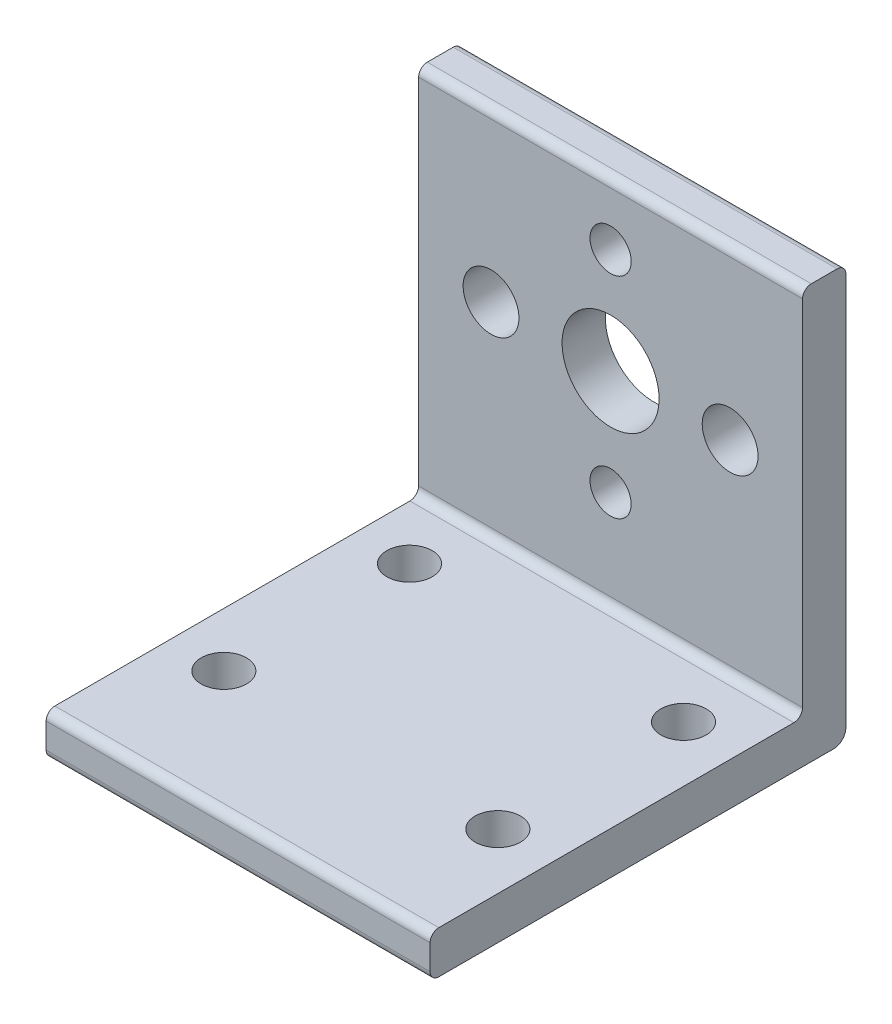
ISO-10303-21;
HEADER;
FILE_DESCRIPTION(('STEP AP214'),'2;1');
FILE_NAME('part.step','',(''),(''),'','','');
FILE_SCHEMA(('AUTOMOTIVE_DESIGN { 1 0 10303 214 1 1 1 1 }'));
ENDSEC;
DATA;
#1=APPLICATION_CONTEXT('core data for automotive mechanical design processes');
#2=APPLICATION_PROTOCOL_DEFINITION('international standard','automotive_design',2000,#1);
#3=PRODUCT_CONTEXT('',#1,'mechanical');
#4=PRODUCT('Part','Part','',(#3));
#5=PRODUCT_RELATED_PRODUCT_CATEGORY('part','',(#4));
#6=PRODUCT_DEFINITION_FORMATION('','',#4);
#7=PRODUCT_DEFINITION_CONTEXT('part definition',#1,'design');
#8=PRODUCT_DEFINITION('design','',#6,#7);
#9=PRODUCT_DEFINITION_SHAPE('','',#8);
#10=(LENGTH_UNIT() NAMED_UNIT(*) SI_UNIT(.MILLI.,.METRE.));
#11=(NAMED_UNIT(*) PLANE_ANGLE_UNIT() SI_UNIT($,.RADIAN.));
#12=(NAMED_UNIT(*) SI_UNIT($,.STERADIAN.) SOLID_ANGLE_UNIT());
#13=UNCERTAINTY_MEASURE_WITH_UNIT(LENGTH_MEASURE(1.E-05),#10,'distance_accuracy_value','');
#14=(GEOMETRIC_REPRESENTATION_CONTEXT(3) GLOBAL_UNCERTAINTY_ASSIGNED_CONTEXT((#13)) GLOBAL_UNIT_ASSIGNED_CONTEXT((#10,
#11,#12)) REPRESENTATION_CONTEXT('',''));
#15=CARTESIAN_POINT('',(0.,0.,0.));
#16=DIRECTION('',(0.,0.,1.));
#17=DIRECTION('',(1.,0.,0.));
#18=AXIS2_PLACEMENT_3D('',#15,#16,#17);
#19=CARTESIAN_POINT('',(27.94,0.,3.1496));
#20=DIRECTION('',(0.,-1.,0.));
#21=DIRECTION('',(0.,0.,-1.));
#22=AXIS2_PLACEMENT_3D('',#19,#20,#21);
#23=PLANE('',#22);
#24=DIRECTION('',(0.,0.,1.));
#25=VECTOR('',#24,1.);
#26=CARTESIAN_POINT('',(27.94,0.,3.1496));
#27=LINE('',#26,#25);
#28=CARTESIAN_POINT('',(27.94,0.,0.635));
#29=VERTEX_POINT('',#28);
#30=CARTESIAN_POINT('',(27.94,0.,2.5146));
#31=VERTEX_POINT('',#30);
#32=EDGE_CURVE('E181',#29,#31,#27,.T.);
#33=ORIENTED_EDGE('',*,*,#32,.F.);
#34=DIRECTION('',(-1.,0.,0.));
#35=VECTOR('',#34,1.);
#36=CARTESIAN_POINT('',(27.94,0.,0.635));
#37=LINE('',#36,#35);
#38=CARTESIAN_POINT('',(0.,0.,0.635));
#39=VERTEX_POINT('',#38);
#40=EDGE_CURVE('E240',#29,#39,#37,.T.);
#41=ORIENTED_EDGE('',*,*,#40,.T.);
#42=DIRECTION('',(0.,0.,1.));
#43=VECTOR('',#42,1.);
#44=CARTESIAN_POINT('',(0.,0.,3.1496));
#45=LINE('',#44,#43);
#46=CARTESIAN_POINT('',(0.,0.,2.5146));
#47=VERTEX_POINT('',#46);
#48=EDGE_CURVE('E172',#39,#47,#45,.T.);
#49=ORIENTED_EDGE('',*,*,#48,.T.);
#50=DIRECTION('',(-1.,0.,0.));
#51=VECTOR('',#50,1.);
#52=CARTESIAN_POINT('',(27.94,0.,2.5146));
#53=LINE('',#52,#51);
#54=EDGE_CURVE('E237',#47,#31,#53,.F.);
#55=ORIENTED_EDGE('',*,*,#54,.T.);
#56=EDGE_LOOP('',(#33,#41,#49,#55));
#57=FACE_BOUND('',#56,.T.);
#58=ADVANCED_FACE('F46',(#57),#23,.F.);
#59=CARTESIAN_POINT('',(27.94,-27.0256,3.1496));
#60=DIRECTION('',(0.,0.,-1.));
#61=DIRECTION('',(0.,1.,0.));
#62=AXIS2_PLACEMENT_3D('',#59,#60,#61);
#63=PLANE('',#62);
#64=CARTESIAN_POINT('',(13.97,-4.5212,3.1496));
#65=DIRECTION('',(0.,0.,-1.));
#66=DIRECTION('',(0.,1.,0.));
#67=AXIS2_PLACEMENT_3D('',#64,#65,#66);
#68=CIRCLE('',#67,1.4986);
#69=CARTESIAN_POINT('',(13.97,-3.0226,3.1496));
#70=VERTEX_POINT('',#69);
#71=EDGE_CURVE('E267',#70,#70,#68,.F.);
#72=ORIENTED_EDGE('',*,*,#71,.F.);
#73=EDGE_LOOP('',(#72));
#74=FACE_BOUND('',#73,.T.);
#75=CARTESIAN_POINT('',(5.2705,-12.1666,3.1496));
#76=DIRECTION('',(0.,0.,-1.));
#77=DIRECTION('',(0.,1.,0.));
#78=AXIS2_PLACEMENT_3D('',#75,#76,#77);
#79=CIRCLE('',#78,2.032);
#80=CARTESIAN_POINT('',(5.2705,-10.1346,3.1496));
#81=VERTEX_POINT('',#80);
#82=EDGE_CURVE('E270',#81,#81,#79,.F.);
#83=ORIENTED_EDGE('',*,*,#82,.F.);
#84=EDGE_LOOP('',(#83));
#85=FACE_BOUND('',#84,.T.);
#86=CARTESIAN_POINT('',(22.6695,-12.1666,3.1496));
#87=DIRECTION('',(0.,0.,-1.));
#88=DIRECTION('',(0.,1.,0.));
#89=AXIS2_PLACEMENT_3D('',#86,#87,#88);
#90=CIRCLE('',#89,2.032);
#91=CARTESIAN_POINT('',(22.6695,-10.1346,3.1496));
#92=VERTEX_POINT('',#91);
#93=EDGE_CURVE('E288',#92,#92,#90,.F.);
#94=ORIENTED_EDGE('',*,*,#93,.F.);
#95=EDGE_LOOP('',(#94));
#96=FACE_BOUND('',#95,.T.);
#97=CARTESIAN_POINT('',(13.97,-19.812,3.1496));
#98=DIRECTION('',(0.,0.,-1.));
#99=DIRECTION('',(0.,1.,0.));
#100=AXIS2_PLACEMENT_3D('',#97,#98,#99);
#101=CIRCLE('',#100,1.4986);
#102=CARTESIAN_POINT('',(13.97,-18.3134,3.1496));
#103=VERTEX_POINT('',#102);
#104=EDGE_CURVE('E292',#103,#103,#101,.F.);
#105=ORIENTED_EDGE('',*,*,#104,.F.);
#106=EDGE_LOOP('',(#105));
#107=FACE_BOUND('',#106,.T.);
#108=CARTESIAN_POINT('',(13.97,-12.1666,3.1496));
#109=DIRECTION('',(0.,0.,-1.));
#110=DIRECTION('',(0.,1.,0.));
#111=AXIS2_PLACEMENT_3D('',#108,#109,#110);
#112=CIRCLE('',#111,3.5306);
#113=CARTESIAN_POINT('',(13.97,-8.636,3.1496));
#114=VERTEX_POINT('',#113);
#115=EDGE_CURVE('E296',#114,#114,#112,.F.);
#116=ORIENTED_EDGE('',*,*,#115,.F.);
#117=EDGE_LOOP('',(#116));
#118=FACE_BOUND('',#117,.T.);
#119=DIRECTION('',(0.,-1.,0.));
#120=VECTOR('',#119,1.);
#121=CARTESIAN_POINT('',(27.94,-27.0256,3.1496));
#122=LINE('',#121,#120);
#123=CARTESIAN_POINT('',(27.94,-0.635,3.1496));
#124=VERTEX_POINT('',#123);
#125=CARTESIAN_POINT('',(27.94,-26.3906,3.1496));
#126=VERTEX_POINT('',#125);
#127=EDGE_CURVE('E280',#124,#126,#122,.T.);
#128=ORIENTED_EDGE('',*,*,#127,.F.);
#129=DIRECTION('',(-1.,0.,0.));
#130=VECTOR('',#129,1.);
#131=CARTESIAN_POINT('',(27.94,-0.635,3.1496));
#132=LINE('',#131,#130);
#133=CARTESIAN_POINT('',(0.,-0.635,3.1496));
#134=VERTEX_POINT('',#133);
#135=EDGE_CURVE('E11',#124,#134,#132,.T.);
#136=ORIENTED_EDGE('',*,*,#135,.T.);
#137=DIRECTION('',(0.,-1.,0.));
#138=VECTOR('',#137,1.);
#139=CARTESIAN_POINT('',(0.,-27.0256,3.1496));
#140=LINE('',#139,#138);
#141=CARTESIAN_POINT('',(0.,-26.3906,3.1496));
#142=VERTEX_POINT('',#141);
#143=EDGE_CURVE('E165',#134,#142,#140,.T.);
#144=ORIENTED_EDGE('',*,*,#143,.T.);
#145=DIRECTION('',(-1.,0.,0.));
#146=VECTOR('',#145,1.);
#147=CARTESIAN_POINT('',(27.94,-26.3906,3.1496));
#148=LINE('',#147,#146);
#149=EDGE_CURVE('E146',#142,#126,#148,.F.);
#150=ORIENTED_EDGE('',*,*,#149,.T.);
#151=EDGE_LOOP('',(#128,#136,#144,#150));
#152=FACE_BOUND('',#151,.T.);
#153=ADVANCED_FACE('F367',(#74,#85,#96,#107,#118,#152),#63,.F.);
#154=CARTESIAN_POINT('',(27.94,-27.0256,30.2514));
#155=DIRECTION('',(0.,-1.,0.));
#156=DIRECTION('',(0.,0.,-1.));
#157=AXIS2_PLACEMENT_3D('',#154,#155,#156);
#158=PLANE('',#157);
#159=CARTESIAN_POINT('',(23.876,-27.0256,7.747));
#160=DIRECTION('',(0.,-1.,0.));
#161=DIRECTION('',(0.,0.,-1.));
#162=AXIS2_PLACEMENT_3D('',#159,#160,#161);
#163=CIRCLE('',#162,1.651);
#164=CARTESIAN_POINT('',(23.876,-27.0256,6.096));
#165=VERTEX_POINT('',#164);
#166=EDGE_CURVE('E317',#165,#165,#163,.F.);
#167=ORIENTED_EDGE('',*,*,#166,.F.);
#168=EDGE_LOOP('',(#167));
#169=FACE_BOUND('',#168,.T.);
#170=CARTESIAN_POINT('',(3.93700000000001,-27.0256,21.2598));
#171=DIRECTION('',(0.,-1.,0.));
#172=DIRECTION('',(0.,0.,-1.));
#173=AXIS2_PLACEMENT_3D('',#170,#171,#172);
#174=CIRCLE('',#173,1.651);
#175=CARTESIAN_POINT('',(3.93700000000001,-27.0256,19.6088));
#176=VERTEX_POINT('',#175);
#177=EDGE_CURVE('E324',#176,#176,#174,.F.);
#178=ORIENTED_EDGE('',*,*,#177,.F.);
#179=EDGE_LOOP('',(#178));
#180=FACE_BOUND('',#179,.T.);
#181=CARTESIAN_POINT('',(23.876,-27.0256,21.2598));
#182=DIRECTION('',(0.,-1.,0.));
#183=DIRECTION('',(0.,0.,-1.));
#184=AXIS2_PLACEMENT_3D('',#181,#182,#183);
#185=CIRCLE('',#184,1.651);
#186=CARTESIAN_POINT('',(23.876,-27.0256,19.6088));
#187=VERTEX_POINT('',#186);
#188=EDGE_CURVE('E328',#187,#187,#185,.F.);
#189=ORIENTED_EDGE('',*,*,#188,.F.);
#190=EDGE_LOOP('',(#189));
#191=FACE_BOUND('',#190,.T.);
#192=CARTESIAN_POINT('',(3.93700000000001,-27.0256,7.747));
#193=DIRECTION('',(0.,-1.,0.));
#194=DIRECTION('',(0.,0.,-1.));
#195=AXIS2_PLACEMENT_3D('',#192,#193,#194);
#196=CIRCLE('',#195,1.651);
#197=CARTESIAN_POINT('',(3.93700000000001,-27.0256,6.096));
#198=VERTEX_POINT('',#197);
#199=EDGE_CURVE('E332',#198,#198,#196,.F.);
#200=ORIENTED_EDGE('',*,*,#199,.F.);
#201=EDGE_LOOP('',(#200));
#202=FACE_BOUND('',#201,.T.);
#203=DIRECTION('',(0.,0.,1.));
#204=VECTOR('',#203,1.);
#205=CARTESIAN_POINT('',(0.,-27.0256,30.2514));
#206=LINE('',#205,#204);
#207=CARTESIAN_POINT('',(0.,-27.0256,3.7846));
#208=VERTEX_POINT('',#207);
#209=CARTESIAN_POINT('',(0.,-27.0256,29.6164));
#210=VERTEX_POINT('',#209);
#211=EDGE_CURVE('E154',#208,#210,#206,.T.);
#212=ORIENTED_EDGE('',*,*,#211,.T.);
#213=DIRECTION('',(-1.,0.,0.));
#214=VECTOR('',#213,1.);
#215=CARTESIAN_POINT('',(27.94,-27.0256,29.6164));
#216=LINE('',#215,#214);
#217=CARTESIAN_POINT('',(27.94,-27.0256,29.6164));
#218=VERTEX_POINT('',#217);
#219=EDGE_CURVE('E62',#210,#218,#216,.F.);
#220=ORIENTED_EDGE('',*,*,#219,.T.);
#221=DIRECTION('',(0.,0.,1.));
#222=VECTOR('',#221,1.);
#223=CARTESIAN_POINT('',(27.94,-27.0256,30.2514));
#224=LINE('',#223,#222);
#225=CARTESIAN_POINT('',(27.94,-27.0256,3.7846));
#226=VERTEX_POINT('',#225);
#227=EDGE_CURVE('E155',#226,#218,#224,.T.);
#228=ORIENTED_EDGE('',*,*,#227,.F.);
#229=DIRECTION('',(-1.,0.,0.));
#230=VECTOR('',#229,1.);
#231=CARTESIAN_POINT('',(0.,-27.0256,3.7846));
#232=LINE('',#231,#230);
#233=EDGE_CURVE('E144',#226,#208,#232,.T.);
#234=ORIENTED_EDGE('',*,*,#233,.T.);
#235=EDGE_LOOP('',(#212,#220,#228,#234));
#236=FACE_BOUND('',#235,.T.);
#237=ADVANCED_FACE('F153',(#169,#180,#191,#202,#236),#158,.F.);
#238=CARTESIAN_POINT('',(27.94,-30.1244,30.2514));
#239=DIRECTION('',(0.,0.,-1.));
#240=DIRECTION('',(-1.,0.,0.));
#241=AXIS2_PLACEMENT_3D('',#238,#239,#240);
#242=PLANE('',#241);
#243=DIRECTION('',(0.,-1.,0.));
#244=VECTOR('',#243,1.);
#245=CARTESIAN_POINT('',(0.,-30.1244,30.2514));
#246=LINE('',#245,#244);
#247=CARTESIAN_POINT('',(0.,-27.6606,30.2514));
#248=VERTEX_POINT('',#247);
#249=CARTESIAN_POINT('',(0.,-29.4894,30.2514));
#250=VERTEX_POINT('',#249);
#251=EDGE_CURVE('E164',#248,#250,#246,.T.);
#252=ORIENTED_EDGE('',*,*,#251,.T.);
#253=DIRECTION('',(-1.,0.,0.));
#254=VECTOR('',#253,1.);
#255=CARTESIAN_POINT('',(27.94,-29.4894,30.2514));
#256=LINE('',#255,#254);
#257=CARTESIAN_POINT('',(27.94,-29.4894,30.2514));
#258=VERTEX_POINT('',#257);
#259=EDGE_CURVE('E221',#250,#258,#256,.F.);
#260=ORIENTED_EDGE('',*,*,#259,.T.);
#261=DIRECTION('',(0.,-1.,0.));
#262=VECTOR('',#261,1.);
#263=CARTESIAN_POINT('',(27.94,-30.1244,30.2514));
#264=LINE('',#263,#262);
#265=CARTESIAN_POINT('',(27.94,-27.6606,30.2514));
#266=VERTEX_POINT('',#265);
#267=EDGE_CURVE('E275',#266,#258,#264,.T.);
#268=ORIENTED_EDGE('',*,*,#267,.F.);
#269=DIRECTION('',(-1.,0.,0.));
#270=VECTOR('',#269,1.);
#271=CARTESIAN_POINT('',(27.94,-27.6606,30.2514));
#272=LINE('',#271,#270);
#273=EDGE_CURVE('E217',#266,#248,#272,.T.);
#274=ORIENTED_EDGE('',*,*,#273,.T.);
#275=EDGE_LOOP('',(#252,#260,#268,#274));
#276=FACE_BOUND('',#275,.T.);
#277=ADVANCED_FACE('F366',(#276),#242,.F.);
#278=CARTESIAN_POINT('',(27.94,-30.1244,0.));
#279=DIRECTION('',(0.,1.,0.));
#280=DIRECTION('',(0.,0.,1.));
#281=AXIS2_PLACEMENT_3D('',#278,#279,#280);
#282=PLANE('',#281);
#283=CARTESIAN_POINT('',(23.876,-30.1244,7.747));
#284=DIRECTION('',(0.,1.,0.));
#285=DIRECTION('',(0.,0.,1.));
#286=AXIS2_PLACEMENT_3D('',#283,#284,#285);
#287=CIRCLE('',#286,1.651);
#288=CARTESIAN_POINT('',(23.876,-30.1244,9.398));
#289=VERTEX_POINT('',#288);
#290=EDGE_CURVE('E340',#289,#289,#287,.T.);
#291=ORIENTED_EDGE('',*,*,#290,.T.);
#292=EDGE_LOOP('',(#291));
#293=FACE_BOUND('',#292,.T.);
#294=CARTESIAN_POINT('',(3.93700000000001,-30.1244,21.2598));
#295=DIRECTION('',(0.,1.,0.));
#296=DIRECTION('',(0.,0.,1.));
#297=AXIS2_PLACEMENT_3D('',#294,#295,#296);
#298=CIRCLE('',#297,1.651);
#299=CARTESIAN_POINT('',(3.93700000000001,-30.1244,22.9108));
#300=VERTEX_POINT('',#299);
#301=EDGE_CURVE('E341',#300,#300,#298,.T.);
#302=ORIENTED_EDGE('',*,*,#301,.T.);
#303=EDGE_LOOP('',(#302));
#304=FACE_BOUND('',#303,.T.);
#305=CARTESIAN_POINT('',(23.876,-30.1244,21.2598));
#306=DIRECTION('',(0.,1.,0.));
#307=DIRECTION('',(0.,0.,1.));
#308=AXIS2_PLACEMENT_3D('',#305,#306,#307);
#309=CIRCLE('',#308,1.651);
#310=CARTESIAN_POINT('',(23.876,-30.1244,22.9108));
#311=VERTEX_POINT('',#310);
#312=EDGE_CURVE('E345',#311,#311,#309,.T.);
#313=ORIENTED_EDGE('',*,*,#312,.T.);
#314=EDGE_LOOP('',(#313));
#315=FACE_BOUND('',#314,.T.);
#316=CARTESIAN_POINT('',(3.93700000000001,-30.1244,7.747));
#317=DIRECTION('',(0.,1.,0.));
#318=DIRECTION('',(0.,0.,1.));
#319=AXIS2_PLACEMENT_3D('',#316,#317,#318);
#320=CIRCLE('',#319,1.651);
#321=CARTESIAN_POINT('',(3.93700000000001,-30.1244,9.398));
#322=VERTEX_POINT('',#321);
#323=EDGE_CURVE('E336',#322,#322,#320,.T.);
#324=ORIENTED_EDGE('',*,*,#323,.T.);
#325=EDGE_LOOP('',(#324));
#326=FACE_BOUND('',#325,.T.);
#327=DIRECTION('',(0.,0.,-1.));
#328=VECTOR('',#327,1.);
#329=CARTESIAN_POINT('',(27.94,-30.1244,0.));
#330=LINE('',#329,#328);
#331=CARTESIAN_POINT('',(27.94,-30.1244,29.6164));
#332=VERTEX_POINT('',#331);
#333=CARTESIAN_POINT('',(27.94,-30.1244,0.888999999999996));
#334=VERTEX_POINT('',#333);
#335=EDGE_CURVE('E258',#332,#334,#330,.T.);
#336=ORIENTED_EDGE('',*,*,#335,.F.);
#337=DIRECTION('',(-1.,0.,0.));
#338=VECTOR('',#337,1.);
#339=CARTESIAN_POINT('',(27.94,-30.1244,29.6164));
#340=LINE('',#339,#338);
#341=CARTESIAN_POINT('',(0.,-30.1244,29.6164));
#342=VERTEX_POINT('',#341);
#343=EDGE_CURVE('E202',#332,#342,#340,.T.);
#344=ORIENTED_EDGE('',*,*,#343,.T.);
#345=DIRECTION('',(0.,0.,-1.));
#346=VECTOR('',#345,1.);
#347=CARTESIAN_POINT('',(0.,-30.1244,0.));
#348=LINE('',#347,#346);
#349=CARTESIAN_POINT('',(0.,-30.1244,0.888999999999996));
#350=VERTEX_POINT('',#349);
#351=EDGE_CURVE('E170',#342,#350,#348,.T.);
#352=ORIENTED_EDGE('',*,*,#351,.T.);
#353=DIRECTION('',(-1.,0.,0.));
#354=VECTOR('',#353,1.);
#355=CARTESIAN_POINT('',(27.94,-30.1244,0.888999999999996));
#356=LINE('',#355,#354);
#357=EDGE_CURVE('E195',#350,#334,#356,.F.);
#358=ORIENTED_EDGE('',*,*,#357,.T.);
#359=EDGE_LOOP('',(#336,#344,#352,#358));
#360=FACE_BOUND('',#359,.T.);
#361=ADVANCED_FACE('F353',(#293,#304,#315,#326,#360),#282,.F.);
#362=CARTESIAN_POINT('',(27.94,0.,0.));
#363=DIRECTION('',(0.,0.,1.));
#364=DIRECTION('',(0.,-1.,0.));
#365=AXIS2_PLACEMENT_3D('',#362,#363,#364);
#366=PLANE('',#365);
#367=CARTESIAN_POINT('',(13.97,-4.5212,0.));
#368=DIRECTION('',(0.,0.,1.));
#369=DIRECTION('',(1.,0.,0.));
#370=AXIS2_PLACEMENT_3D('',#367,#368,#369);
#371=CIRCLE('',#370,1.4986);
#372=CARTESIAN_POINT('',(15.4686,-4.5212,0.));
#373=VERTEX_POINT('',#372);
#374=EDGE_CURVE('E304',#373,#373,#371,.T.);
#375=ORIENTED_EDGE('',*,*,#374,.T.);
#376=EDGE_LOOP('',(#375));
#377=FACE_BOUND('',#376,.T.);
#378=CARTESIAN_POINT('',(5.2705,-12.1666,0.));
#379=DIRECTION('',(0.,0.,1.));
#380=DIRECTION('',(1.,0.,0.));
#381=AXIS2_PLACEMENT_3D('',#378,#379,#380);
#382=CIRCLE('',#381,2.032);
#383=CARTESIAN_POINT('',(7.3025,-12.1666,0.));
#384=VERTEX_POINT('',#383);
#385=EDGE_CURVE('E305',#384,#384,#382,.T.);
#386=ORIENTED_EDGE('',*,*,#385,.T.);
#387=EDGE_LOOP('',(#386));
#388=FACE_BOUND('',#387,.T.);
#389=CARTESIAN_POINT('',(22.6695,-12.1666,0.));
#390=DIRECTION('',(0.,0.,1.));
#391=DIRECTION('',(-1.,0.,0.));
#392=AXIS2_PLACEMENT_3D('',#389,#390,#391);
#393=CIRCLE('',#392,2.032);
#394=CARTESIAN_POINT('',(20.6375,-12.1666,0.));
#395=VERTEX_POINT('',#394);
#396=EDGE_CURVE('E309',#395,#395,#393,.T.);
#397=ORIENTED_EDGE('',*,*,#396,.T.);
#398=EDGE_LOOP('',(#397));
#399=FACE_BOUND('',#398,.T.);
#400=CARTESIAN_POINT('',(13.97,-19.812,0.));
#401=DIRECTION('',(0.,0.,1.));
#402=DIRECTION('',(-1.,0.,0.));
#403=AXIS2_PLACEMENT_3D('',#400,#401,#402);
#404=CIRCLE('',#403,1.4986);
#405=CARTESIAN_POINT('',(12.4714,-19.812,0.));
#406=VERTEX_POINT('',#405);
#407=EDGE_CURVE('E313',#406,#406,#404,.T.);
#408=ORIENTED_EDGE('',*,*,#407,.T.);
#409=EDGE_LOOP('',(#408));
#410=FACE_BOUND('',#409,.T.);
#411=CARTESIAN_POINT('',(13.97,-12.1666,0.));
#412=DIRECTION('',(0.,0.,1.));
#413=DIRECTION('',(1.,0.,0.));
#414=AXIS2_PLACEMENT_3D('',#411,#412,#413);
#415=CIRCLE('',#414,3.5306);
#416=CARTESIAN_POINT('',(17.5006,-12.1666,0.));
#417=VERTEX_POINT('',#416);
#418=EDGE_CURVE('E300',#417,#417,#415,.T.);
#419=ORIENTED_EDGE('',*,*,#418,.T.);
#420=EDGE_LOOP('',(#419));
#421=FACE_BOUND('',#420,.T.);
#422=DIRECTION('',(0.,1.,0.));
#423=VECTOR('',#422,1.);
#424=CARTESIAN_POINT('',(0.,0.,0.));
#425=LINE('',#424,#423);
#426=CARTESIAN_POINT('',(0.,-29.2354,0.));
#427=VERTEX_POINT('',#426);
#428=CARTESIAN_POINT('',(0.,-0.635,0.));
#429=VERTEX_POINT('',#428);
#430=EDGE_CURVE('E178',#427,#429,#425,.T.);
#431=ORIENTED_EDGE('',*,*,#430,.T.);
#432=DIRECTION('',(-1.,0.,0.));
#433=VECTOR('',#432,1.);
#434=CARTESIAN_POINT('',(27.94,-0.635,0.));
#435=LINE('',#434,#433);
#436=CARTESIAN_POINT('',(27.94,-0.635,0.));
#437=VERTEX_POINT('',#436);
#438=EDGE_CURVE('E55',#429,#437,#435,.F.);
#439=ORIENTED_EDGE('',*,*,#438,.T.);
#440=DIRECTION('',(0.,1.,0.));
#441=VECTOR('',#440,1.);
#442=CARTESIAN_POINT('',(27.94,0.,0.));
#443=LINE('',#442,#441);
#444=CARTESIAN_POINT('',(27.94,-29.2354,0.));
#445=VERTEX_POINT('',#444);
#446=EDGE_CURVE('E157',#445,#437,#443,.T.);
#447=ORIENTED_EDGE('',*,*,#446,.F.);
#448=DIRECTION('',(-1.,0.,0.));
#449=VECTOR('',#448,1.);
#450=CARTESIAN_POINT('',(27.94,-29.2354,0.));
#451=LINE('',#450,#449);
#452=EDGE_CURVE('E187',#445,#427,#451,.T.);
#453=ORIENTED_EDGE('',*,*,#452,.T.);
#454=EDGE_LOOP('',(#431,#439,#447,#453));
#455=FACE_BOUND('',#454,.T.);
#456=ADVANCED_FACE('F248',(#377,#388,#399,#410,#421,#455),#366,.F.);
#457=CARTESIAN_POINT('',(27.94,0.,0.));
#458=DIRECTION('',(-1.,0.,0.));
#459=DIRECTION('',(0.,0.,1.));
#460=AXIS2_PLACEMENT_3D('',#457,#458,#459);
#461=PLANE('',#460);
#462=ORIENTED_EDGE('',*,*,#267,.T.);
#463=CARTESIAN_POINT('',(27.94,-29.4894,29.6164));
#464=DIRECTION('',(-1.,0.,0.));
#465=DIRECTION('',(0.,0.,1.));
#466=AXIS2_PLACEMENT_3D('',#463,#464,#465);
#467=CIRCLE('',#466,0.635);
#468=EDGE_CURVE('E232',#258,#332,#467,.F.);
#469=ORIENTED_EDGE('',*,*,#468,.T.);
#470=ORIENTED_EDGE('',*,*,#335,.T.);
#471=CARTESIAN_POINT('',(27.94,-29.2354,0.888999999999996));
#472=DIRECTION('',(-1.,0.,0.));
#473=DIRECTION('',(0.,0.,1.));
#474=AXIS2_PLACEMENT_3D('',#471,#472,#473);
#475=CIRCLE('',#474,0.889);
#476=EDGE_CURVE('E199',#334,#445,#475,.F.);
#477=ORIENTED_EDGE('',*,*,#476,.T.);
#478=ORIENTED_EDGE('',*,*,#446,.T.);
#479=CARTESIAN_POINT('',(27.94,-0.635,0.635));
#480=DIRECTION('',(-1.,0.,0.));
#481=DIRECTION('',(0.,0.,1.));
#482=AXIS2_PLACEMENT_3D('',#479,#480,#481);
#483=CIRCLE('',#482,0.635);
#484=EDGE_CURVE('E226',#437,#29,#483,.F.);
#485=ORIENTED_EDGE('',*,*,#484,.T.);
#486=ORIENTED_EDGE('',*,*,#32,.T.);
#487=CARTESIAN_POINT('',(27.94,-0.635,2.5146));
#488=DIRECTION('',(-1.,0.,0.));
#489=DIRECTION('',(0.,0.,1.));
#490=AXIS2_PLACEMENT_3D('',#487,#488,#489);
#491=CIRCLE('',#490,0.635);
#492=EDGE_CURVE('E70',#31,#124,#491,.F.);
#493=ORIENTED_EDGE('',*,*,#492,.T.);
#494=ORIENTED_EDGE('',*,*,#127,.T.);
#495=CARTESIAN_POINT('',(27.94,-26.3906,3.7846));
#496=DIRECTION('',(-1.,0.,0.));
#497=DIRECTION('',(0.,0.,1.));
#498=AXIS2_PLACEMENT_3D('',#495,#496,#497);
#499=CIRCLE('',#498,0.635);
#500=EDGE_CURVE('E151',#126,#226,#499,.T.);
#501=ORIENTED_EDGE('',*,*,#500,.T.);
#502=ORIENTED_EDGE('',*,*,#227,.T.);
#503=CARTESIAN_POINT('',(27.94,-27.6606,29.6164));
#504=DIRECTION('',(-1.,0.,0.));
#505=DIRECTION('',(0.,0.,1.));
#506=AXIS2_PLACEMENT_3D('',#503,#504,#505);
#507=CIRCLE('',#506,0.635);
#508=EDGE_CURVE('E229',#218,#266,#507,.F.);
#509=ORIENTED_EDGE('',*,*,#508,.T.);
#510=EDGE_LOOP('',(#462,#469,#470,#477,#478,#485,#486,#493,#494,#501,#502,#509));
#511=FACE_BOUND('',#510,.T.);
#512=ADVANCED_FACE('F254',(#511),#461,.F.);
#513=CARTESIAN_POINT('',(0.,0.,0.));
#514=DIRECTION('',(-1.,0.,0.));
#515=DIRECTION('',(0.,0.,1.));
#516=AXIS2_PLACEMENT_3D('',#513,#514,#515);
#517=PLANE('',#516);
#518=ORIENTED_EDGE('',*,*,#351,.F.);
#519=CARTESIAN_POINT('',(0.,-29.4894,29.6164));
#520=DIRECTION('',(-1.,0.,0.));
#521=DIRECTION('',(0.,0.,1.));
#522=AXIS2_PLACEMENT_3D('',#519,#520,#521);
#523=CIRCLE('',#522,0.635);
#524=EDGE_CURVE('E214',#342,#250,#523,.T.);
#525=ORIENTED_EDGE('',*,*,#524,.T.);
#526=ORIENTED_EDGE('',*,*,#251,.F.);
#527=CARTESIAN_POINT('',(0.,-27.6606,29.6164));
#528=DIRECTION('',(-1.,0.,0.));
#529=DIRECTION('',(0.,0.,1.));
#530=AXIS2_PLACEMENT_3D('',#527,#528,#529);
#531=CIRCLE('',#530,0.635);
#532=EDGE_CURVE('E162',#248,#210,#531,.T.);
#533=ORIENTED_EDGE('',*,*,#532,.T.);
#534=ORIENTED_EDGE('',*,*,#211,.F.);
#535=CARTESIAN_POINT('',(0.,-26.3906,3.7846));
#536=DIRECTION('',(-1.,0.,0.));
#537=DIRECTION('',(0.,0.,1.));
#538=AXIS2_PLACEMENT_3D('',#535,#536,#537);
#539=CIRCLE('',#538,0.635);
#540=EDGE_CURVE('E140',#208,#142,#539,.F.);
#541=ORIENTED_EDGE('',*,*,#540,.T.);
#542=ORIENTED_EDGE('',*,*,#143,.F.);
#543=CARTESIAN_POINT('',(0.,-0.635,2.5146));
#544=DIRECTION('',(-1.,0.,0.));
#545=DIRECTION('',(0.,0.,1.));
#546=AXIS2_PLACEMENT_3D('',#543,#544,#545);
#547=CIRCLE('',#546,0.635);
#548=EDGE_CURVE('E206',#134,#47,#547,.T.);
#549=ORIENTED_EDGE('',*,*,#548,.T.);
#550=ORIENTED_EDGE('',*,*,#48,.F.);
#551=CARTESIAN_POINT('',(0.,-0.635,0.635));
#552=DIRECTION('',(-1.,0.,0.));
#553=DIRECTION('',(0.,0.,1.));
#554=AXIS2_PLACEMENT_3D('',#551,#552,#553);
#555=CIRCLE('',#554,0.635);
#556=EDGE_CURVE('E209',#39,#429,#555,.T.);
#557=ORIENTED_EDGE('',*,*,#556,.T.);
#558=ORIENTED_EDGE('',*,*,#430,.F.);
#559=CARTESIAN_POINT('',(0.,-29.2354,0.888999999999996));
#560=DIRECTION('',(-1.,0.,0.));
#561=DIRECTION('',(0.,0.,1.));
#562=AXIS2_PLACEMENT_3D('',#559,#560,#561);
#563=CIRCLE('',#562,0.889);
#564=EDGE_CURVE('E191',#427,#350,#563,.T.);
#565=ORIENTED_EDGE('',*,*,#564,.T.);
#566=EDGE_LOOP('',(#518,#525,#526,#533,#534,#541,#542,#549,#550,#557,#558,#565));
#567=FACE_BOUND('',#566,.T.);
#568=ADVANCED_FACE('F160',(#567),#517,.T.);
#569=CARTESIAN_POINT('',(13.97,-12.1666,30.2514));
#570=DIRECTION('',(0.,0.,-1.));
#571=DIRECTION('',(-1.,0.,0.));
#572=AXIS2_PLACEMENT_3D('',#569,#570,#571);
#573=CYLINDRICAL_SURFACE('',#572,3.5306);
#574=ORIENTED_EDGE('',*,*,#418,.F.);
#575=EDGE_LOOP('',(#574));
#576=FACE_BOUND('',#575,.T.);
#577=ORIENTED_EDGE('',*,*,#115,.T.);
#578=EDGE_LOOP('',(#577));
#579=FACE_BOUND('',#578,.T.);
#580=ADVANCED_FACE('F440',(#576,#579),#573,.F.);
#581=CARTESIAN_POINT('',(13.97,-19.812,30.2514));
#582=DIRECTION('',(0.,0.,-1.));
#583=DIRECTION('',(-1.,0.,0.));
#584=AXIS2_PLACEMENT_3D('',#581,#582,#583);
#585=CYLINDRICAL_SURFACE('',#584,1.4986);
#586=ORIENTED_EDGE('',*,*,#407,.F.);
#587=EDGE_LOOP('',(#586));
#588=FACE_BOUND('',#587,.T.);
#589=ORIENTED_EDGE('',*,*,#104,.T.);
#590=EDGE_LOOP('',(#589));
#591=FACE_BOUND('',#590,.T.);
#592=ADVANCED_FACE('F445',(#588,#591),#585,.F.);
#593=CARTESIAN_POINT('',(22.6695,-12.1666,30.2514));
#594=DIRECTION('',(0.,0.,-1.));
#595=DIRECTION('',(-1.,0.,0.));
#596=AXIS2_PLACEMENT_3D('',#593,#594,#595);
#597=CYLINDRICAL_SURFACE('',#596,2.032);
#598=ORIENTED_EDGE('',*,*,#396,.F.);
#599=EDGE_LOOP('',(#598));
#600=FACE_BOUND('',#599,.T.);
#601=ORIENTED_EDGE('',*,*,#93,.T.);
#602=EDGE_LOOP('',(#601));
#603=FACE_BOUND('',#602,.T.);
#604=ADVANCED_FACE('F448',(#600,#603),#597,.F.);
#605=CARTESIAN_POINT('',(5.2705,-12.1666,30.2514));
#606=DIRECTION('',(0.,0.,-1.));
#607=DIRECTION('',(-1.,0.,0.));
#608=AXIS2_PLACEMENT_3D('',#605,#606,#607);
#609=CYLINDRICAL_SURFACE('',#608,2.032);
#610=ORIENTED_EDGE('',*,*,#385,.F.);
#611=EDGE_LOOP('',(#610));
#612=FACE_BOUND('',#611,.T.);
#613=ORIENTED_EDGE('',*,*,#82,.T.);
#614=EDGE_LOOP('',(#613));
#615=FACE_BOUND('',#614,.T.);
#616=ADVANCED_FACE('F379',(#612,#615),#609,.F.);
#617=CARTESIAN_POINT('',(13.97,-4.5212,30.2514));
#618=DIRECTION('',(0.,0.,-1.));
#619=DIRECTION('',(-1.,0.,0.));
#620=AXIS2_PLACEMENT_3D('',#617,#618,#619);
#621=CYLINDRICAL_SURFACE('',#620,1.4986);
#622=ORIENTED_EDGE('',*,*,#374,.F.);
#623=EDGE_LOOP('',(#622));
#624=FACE_BOUND('',#623,.T.);
#625=ORIENTED_EDGE('',*,*,#71,.T.);
#626=EDGE_LOOP('',(#625));
#627=FACE_BOUND('',#626,.T.);
#628=ADVANCED_FACE('F373',(#624,#627),#621,.F.);
#629=CARTESIAN_POINT('',(3.93700000000001,0.,7.747));
#630=DIRECTION('',(0.,-1.,0.));
#631=DIRECTION('',(0.,0.,-1.));
#632=AXIS2_PLACEMENT_3D('',#629,#630,#631);
#633=CYLINDRICAL_SURFACE('',#632,1.651);
#634=ORIENTED_EDGE('',*,*,#323,.F.);
#635=EDGE_LOOP('',(#634));
#636=FACE_BOUND('',#635,.T.);
#637=ORIENTED_EDGE('',*,*,#199,.T.);
#638=EDGE_LOOP('',(#637));
#639=FACE_BOUND('',#638,.T.);
#640=ADVANCED_FACE('F360',(#636,#639),#633,.F.);
#641=CARTESIAN_POINT('',(23.876,0.,21.2598));
#642=DIRECTION('',(0.,-1.,0.));
#643=DIRECTION('',(0.,0.,-1.));
#644=AXIS2_PLACEMENT_3D('',#641,#642,#643);
#645=CYLINDRICAL_SURFACE('',#644,1.651);
#646=ORIENTED_EDGE('',*,*,#312,.F.);
#647=EDGE_LOOP('',(#646));
#648=FACE_BOUND('',#647,.T.);
#649=ORIENTED_EDGE('',*,*,#188,.T.);
#650=EDGE_LOOP('',(#649));
#651=FACE_BOUND('',#650,.T.);
#652=ADVANCED_FACE('F356',(#648,#651),#645,.F.);
#653=CARTESIAN_POINT('',(3.93700000000001,0.,21.2598));
#654=DIRECTION('',(0.,-1.,0.));
#655=DIRECTION('',(0.,0.,-1.));
#656=AXIS2_PLACEMENT_3D('',#653,#654,#655);
#657=CYLINDRICAL_SURFACE('',#656,1.651);
#658=ORIENTED_EDGE('',*,*,#301,.F.);
#659=EDGE_LOOP('',(#658));
#660=FACE_BOUND('',#659,.T.);
#661=ORIENTED_EDGE('',*,*,#177,.T.);
#662=EDGE_LOOP('',(#661));
#663=FACE_BOUND('',#662,.T.);
#664=ADVANCED_FACE('F359',(#660,#663),#657,.F.);
#665=CARTESIAN_POINT('',(23.876,0.,7.747));
#666=DIRECTION('',(0.,-1.,0.));
#667=DIRECTION('',(0.,0.,-1.));
#668=AXIS2_PLACEMENT_3D('',#665,#666,#667);
#669=CYLINDRICAL_SURFACE('',#668,1.651);
#670=ORIENTED_EDGE('',*,*,#290,.F.);
#671=EDGE_LOOP('',(#670));
#672=FACE_BOUND('',#671,.T.);
#673=ORIENTED_EDGE('',*,*,#166,.T.);
#674=EDGE_LOOP('',(#673));
#675=FACE_BOUND('',#674,.T.);
#676=ADVANCED_FACE('F397',(#672,#675),#669,.F.);
#677=CARTESIAN_POINT('',(27.94,-26.3906,3.7846));
#678=DIRECTION('',(1.,0.,0.));
#679=DIRECTION('',(0.,0.,-1.));
#680=AXIS2_PLACEMENT_3D('',#677,#678,#679);
#681=CYLINDRICAL_SURFACE('',#680,0.635);
#682=ORIENTED_EDGE('',*,*,#500,.F.);
#683=ORIENTED_EDGE('',*,*,#149,.F.);
#684=ORIENTED_EDGE('',*,*,#540,.F.);
#685=ORIENTED_EDGE('',*,*,#233,.F.);
#686=EDGE_LOOP('',(#682,#683,#684,#685));
#687=FACE_BOUND('',#686,.T.);
#688=ADVANCED_FACE('F143',(#687),#681,.F.);
#689=CARTESIAN_POINT('',(27.94,-29.2354,0.888999999999996));
#690=DIRECTION('',(-1.,0.,0.));
#691=DIRECTION('',(0.,0.,1.));
#692=AXIS2_PLACEMENT_3D('',#689,#690,#691);
#693=CYLINDRICAL_SURFACE('',#692,0.889);
#694=ORIENTED_EDGE('',*,*,#476,.F.);
#695=ORIENTED_EDGE('',*,*,#357,.F.);
#696=ORIENTED_EDGE('',*,*,#564,.F.);
#697=ORIENTED_EDGE('',*,*,#452,.F.);
#698=EDGE_LOOP('',(#694,#695,#696,#697));
#699=FACE_BOUND('',#698,.T.);
#700=ADVANCED_FACE('F396',(#699),#693,.T.);
#701=CARTESIAN_POINT('',(27.94,-29.4894,29.6164));
#702=DIRECTION('',(-1.,0.,0.));
#703=DIRECTION('',(0.,0.,1.));
#704=AXIS2_PLACEMENT_3D('',#701,#702,#703);
#705=CYLINDRICAL_SURFACE('',#704,0.635);
#706=ORIENTED_EDGE('',*,*,#468,.F.);
#707=ORIENTED_EDGE('',*,*,#259,.F.);
#708=ORIENTED_EDGE('',*,*,#524,.F.);
#709=ORIENTED_EDGE('',*,*,#343,.F.);
#710=EDGE_LOOP('',(#706,#707,#708,#709));
#711=FACE_BOUND('',#710,.T.);
#712=ADVANCED_FACE('F399',(#711),#705,.T.);
#713=CARTESIAN_POINT('',(27.94,-27.6606,29.6164));
#714=DIRECTION('',(-1.,0.,0.));
#715=DIRECTION('',(0.,0.,1.));
#716=AXIS2_PLACEMENT_3D('',#713,#714,#715);
#717=CYLINDRICAL_SURFACE('',#716,0.635);
#718=ORIENTED_EDGE('',*,*,#508,.F.);
#719=ORIENTED_EDGE('',*,*,#219,.F.);
#720=ORIENTED_EDGE('',*,*,#532,.F.);
#721=ORIENTED_EDGE('',*,*,#273,.F.);
#722=EDGE_LOOP('',(#718,#719,#720,#721));
#723=FACE_BOUND('',#722,.T.);
#724=ADVANCED_FACE('F403',(#723),#717,.T.);
#725=CARTESIAN_POINT('',(27.94,-0.635,0.635));
#726=DIRECTION('',(-1.,0.,0.));
#727=DIRECTION('',(0.,0.,1.));
#728=AXIS2_PLACEMENT_3D('',#725,#726,#727);
#729=CYLINDRICAL_SURFACE('',#728,0.635);
#730=ORIENTED_EDGE('',*,*,#484,.F.);
#731=ORIENTED_EDGE('',*,*,#438,.F.);
#732=ORIENTED_EDGE('',*,*,#556,.F.);
#733=ORIENTED_EDGE('',*,*,#40,.F.);
#734=EDGE_LOOP('',(#730,#731,#732,#733));
#735=FACE_BOUND('',#734,.T.);
#736=ADVANCED_FACE('F261',(#735),#729,.T.);
#737=CARTESIAN_POINT('',(27.94,-0.635,2.5146));
#738=DIRECTION('',(-1.,0.,0.));
#739=DIRECTION('',(0.,0.,1.));
#740=AXIS2_PLACEMENT_3D('',#737,#738,#739);
#741=CYLINDRICAL_SURFACE('',#740,0.635);
#742=ORIENTED_EDGE('',*,*,#492,.F.);
#743=ORIENTED_EDGE('',*,*,#54,.F.);
#744=ORIENTED_EDGE('',*,*,#548,.F.);
#745=ORIENTED_EDGE('',*,*,#135,.F.);
#746=EDGE_LOOP('',(#742,#743,#744,#745));
#747=FACE_BOUND('',#746,.T.);
#748=ADVANCED_FACE('F48',(#747),#741,.T.);
#749=CLOSED_SHELL('',(#58,#153,#237,#277,#361,#456,#512,#568,#580,#592,#604,#616,#628,#640,#652,
#664,#676,#688,#700,#712,#724,#736,#748));
#750=MANIFOLD_SOLID_BREP('B2',#749);
#751=ADVANCED_BREP_SHAPE_REPRESENTATION('',(#18,#750),#14);
#752=SHAPE_DEFINITION_REPRESENTATION(#9,#751);
ENDSEC;
END-ISO-10303-21;
